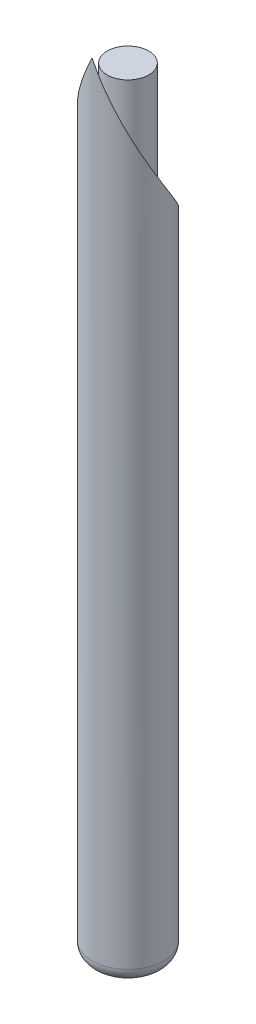
ISO-10303-21;
HEADER;
FILE_DESCRIPTION(('STEP AP214'),'2;1');
FILE_NAME('part.step','',(''),(''),'','','');
FILE_SCHEMA(('AUTOMOTIVE_DESIGN { 1 0 10303 214 1 1 1 1 }'));
ENDSEC;
DATA;
#1=APPLICATION_CONTEXT('core data for automotive mechanical design processes');
#2=APPLICATION_PROTOCOL_DEFINITION('international standard','automotive_design',2000,#1);
#3=PRODUCT_CONTEXT('',#1,'mechanical');
#4=PRODUCT('Part','Part','',(#3));
#5=PRODUCT_RELATED_PRODUCT_CATEGORY('part','',(#4));
#6=PRODUCT_DEFINITION_FORMATION('','',#4);
#7=PRODUCT_DEFINITION_CONTEXT('part definition',#1,'design');
#8=PRODUCT_DEFINITION('design','',#6,#7);
#9=PRODUCT_DEFINITION_SHAPE('','',#8);
#10=(LENGTH_UNIT() NAMED_UNIT(*) SI_UNIT(.MILLI.,.METRE.));
#11=(NAMED_UNIT(*) PLANE_ANGLE_UNIT() SI_UNIT($,.RADIAN.));
#12=(NAMED_UNIT(*) SI_UNIT($,.STERADIAN.) SOLID_ANGLE_UNIT());
#13=UNCERTAINTY_MEASURE_WITH_UNIT(LENGTH_MEASURE(1.E-05),#10,'distance_accuracy_value','');
#14=(GEOMETRIC_REPRESENTATION_CONTEXT(3) GLOBAL_UNCERTAINTY_ASSIGNED_CONTEXT((#13)) GLOBAL_UNIT_ASSIGNED_CONTEXT((#10,
#11,#12)) REPRESENTATION_CONTEXT('',''));
#15=CARTESIAN_POINT('',(0.,0.,0.));
#16=DIRECTION('',(0.,0.,1.));
#17=DIRECTION('',(1.,0.,0.));
#18=AXIS2_PLACEMENT_3D('',#15,#16,#17);
#19=CARTESIAN_POINT('',(-10.,11.1114275653245,4.99999999999909));
#20=CARTESIAN_POINT('',(-10.,2.7442766808939,4.99999999999909));
#21=CARTESIAN_POINT('',(-10.,-4.9625466788277,0.138565281185924));
#22=CARTESIAN_POINT('',(-10.,-11.1114767008031,-4.99999999999915));
#23=B_SPLINE_CURVE_WITH_KNOTS('',3,(#19,#20,#21,#22),.UNSPECIFIED.,.F.,.F.,(4,4),(0.,
0.301496066824049),.UNSPECIFIED.);
#24=DIRECTION('',(1.,0.,0.));
#25=VECTOR('',#24,1.);
#26=SURFACE_OF_LINEAR_EXTRUSION('',#23,#25);
#27=CARTESIAN_POINT('',(1.73050300992406,8.38521960200289E-13,2.32709246327587));
#28=CARTESIAN_POINT('',(1.68230439599726,0.0770166600115847,2.36293514698108));
#29=CARTESIAN_POINT('',(1.63202397147869,0.153099253088412,2.39800656917039));
#30=CARTESIAN_POINT('',(1.52671607429452,0.302813393100638,2.46639075485378));
#31=CARTESIAN_POINT('',(1.47168631458764,0.376443735236019,2.49970265846501));
#32=CARTESIAN_POINT('',(1.35631328761747,0.520133654902101,2.56413168570292));
#33=CARTESIAN_POINT('',(1.29598345697372,0.590201589529039,2.59525401866963));
#34=CARTESIAN_POINT('',(1.1690388937416,0.725541581185427,2.65485691386004));
#35=CARTESIAN_POINT('',(1.10243112589493,0.790818813238115,2.683340335692));
#36=CARTESIAN_POINT('',(0.970943418218382,0.906476096005211,2.73341292832752));
#37=CARTESIAN_POINT('',(0.906966370497955,0.957689349605518,2.755416921259));
#38=CARTESIAN_POINT('',(0.772673398173886,1.05283763679619,2.7960522768867));
#39=CARTESIAN_POINT('',(0.70235408285115,1.09676874114268,2.81468181932334));
#40=CARTESIAN_POINT('',(0.553884293782435,1.17485221371469,2.84763796004768));
#41=CARTESIAN_POINT('',(0.475633217218526,1.20885003271819,2.86189670596456));
#42=CARTESIAN_POINT('',(0.354112025385858,1.24876691496359,2.87858996076728));
#43=CARTESIAN_POINT('',(0.312951568075793,1.26022077212202,2.88336979184072));
#44=CARTESIAN_POINT('',(0.229530326683386,1.27901547733805,2.89120494543591));
#45=CARTESIAN_POINT('',(0.187269843649326,1.28635743858313,2.8942607346982));
#46=CARTESIAN_POINT('',(0.107409612613168,1.29594853557585,2.89825094700855));
#47=CARTESIAN_POINT('',(0.0698824410926284,1.29871669064601,2.89940159990666));
#48=CARTESIAN_POINT('',(-0.00528032083049251,1.30073009843542,2.9002386101587));
#49=CARTESIAN_POINT('',(-0.0429158962271985,1.29997581734118,2.89992516128322));
#50=CARTESIAN_POINT('',(-0.117926680548469,1.29497114600279,2.8978442085095));
#51=CARTESIAN_POINT('',(-0.155301784301574,1.29071941770105,2.89607614810418));
#52=CARTESIAN_POINT('',(-0.22943588539465,1.27888414004597,2.89114917411178));
#53=CARTESIAN_POINT('',(-0.266194517895001,1.2712986852812,2.88798946511734));
#54=CARTESIAN_POINT('',(-0.379291507434523,1.24285088097364,2.87612213229898));
#55=CARTESIAN_POINT('',(-0.454082945557251,1.21661342455111,2.86515607307049));
#56=CARTESIAN_POINT('',(-0.598139763325299,1.15340709432894,2.83859950101676));
#57=CARTESIAN_POINT('',(-0.667387599979585,1.11640574656495,2.82299499113159));
#58=CARTESIAN_POINT('',(-0.787612742745344,1.042312649023,2.79155232621476));
#59=CARTESIAN_POINT('',(-0.839580473628409,1.00654013866253,2.77630721203345));
#60=CARTESIAN_POINT('',(-0.939854673539082,0.931102044376801,2.74398359170851));
#61=CARTESIAN_POINT('',(-0.988165941983515,0.891441726272376,2.72690756257481));
#62=CARTESIAN_POINT('',(-1.08163216256403,0.808991710333012,2.69120426906679));
#63=CARTESIAN_POINT('',(-1.12677883471714,0.766194361718374,2.67257319571595));
#64=CARTESIAN_POINT('',(-1.21411924980476,0.678217636736536,2.63404495135817));
#65=CARTESIAN_POINT('',(-1.25631226235521,0.633037676003273,2.61414746949848));
#66=CARTESIAN_POINT('',(-1.3379975893317,0.540841732021512,2.57329471288199));
#67=CARTESIAN_POINT('',(-1.37749210620693,0.493827296486749,2.55234032562833));
#68=CARTESIAN_POINT('',(-1.45407414177045,0.398304609801829,2.50950050389542));
#69=CARTESIAN_POINT('',(-1.49116193640719,0.349796530852655,2.48761517663336));
#70=CARTESIAN_POINT('',(-1.56310088345083,0.251640963721081,2.44305198227839));
#71=CARTESIAN_POINT('',(-1.59795546863437,0.201995391698085,2.42037541856468));
#72=CARTESIAN_POINT('',(-1.66567868159732,0.101704734557945,2.37427703320652));
#73=CARTESIAN_POINT('',(-1.6985471507368,0.0510595700263876,2.35085515225777));
#74=CARTESIAN_POINT('',(-1.78349908966655,-0.0846779624380651,2.28768406080897));
#75=CARTESIAN_POINT('',(-1.83398518114569,-0.170495681165264,2.24733832014102));
#76=CARTESIAN_POINT('',(-1.93050144407487,-0.343834941333669,2.16498991408722));
#77=CARTESIAN_POINT('',(-1.97653041458353,-0.431356934392544,2.1229868064021));
#78=CARTESIAN_POINT('',(-2.10865903414454,-0.695989030295505,1.99466356592845));
#79=CARTESIAN_POINT('',(-2.18872361215452,-0.875039015776916,1.90608814692142));
#80=CARTESIAN_POINT('',(-2.33538598425081,-1.23712371945442,1.72329643635539));
#81=CARTESIAN_POINT('',(-2.40190346284312,-1.42017546133924,1.62905056304469));
#82=CARTESIAN_POINT('',(-2.52208660734763,-1.787945333404,1.43596522771786));
#83=CARTESIAN_POINT('',(-2.57575702129014,-1.97266282168381,1.33712747894787));
#84=CARTESIAN_POINT('',(-2.68963537214987,-2.41591027130043,1.09548208078914));
#85=CARTESIAN_POINT('',(-2.74408992567781,-2.67485238442002,0.950691178814285));
#86=CARTESIAN_POINT('',(-2.82951845010938,-3.19270056776102,0.653955093193511));
#87=CARTESIAN_POINT('',(-2.86047847701871,-3.45160652553973,0.502005717719115));
#88=CARTESIAN_POINT('',(-2.89776027233595,-3.96666764171407,0.192750956562281));
#89=CARTESIAN_POINT('',(-2.90417571286132,-4.22282953028617,0.0354682496808322));
#90=CARTESIAN_POINT('',(-2.89051692367582,-4.7315353069514,-0.283535260686425));
#91=CARTESIAN_POINT('',(-2.87046501339863,-4.98408206215959,-0.44525221229169));
#92=CARTESIAN_POINT('',(-2.81769743235211,-5.36079629349095,-0.691205802688302));
#93=CARTESIAN_POINT('',(-2.79602130027551,-5.48715996805384,-0.774529799352293));
#94=CARTESIAN_POINT('',(-2.74431510467675,-5.73795660127393,-0.9414750134502));
#95=CARTESIAN_POINT('',(-2.71428691384246,-5.86238998614268,-1.02509616011301));
#96=CARTESIAN_POINT('',(-2.64514970769816,-6.1088310546393,-1.19220830698354));
#97=CARTESIAN_POINT('',(-2.60603987208666,-6.23083851806391,-1.27569929474841));
#98=CARTESIAN_POINT('',(-2.51785623536858,-6.4717340837371,-1.44196306093751));
#99=CARTESIAN_POINT('',(-2.46878328903811,-6.59062245259816,-1.52473590033982));
#100=CARTESIAN_POINT('',(-2.37222635029837,-6.79733022121809,-1.66981352609809));
#101=CARTESIAN_POINT('',(-2.32699394240271,-6.88598249244594,-1.73242954791001));
#102=CARTESIAN_POINT('',(-2.22945096895466,-7.06029743660932,-1.85627631484841));
#103=CARTESIAN_POINT('',(-2.17714233252784,-7.14596091637216,-1.91750743223652));
#104=CARTESIAN_POINT('',(-2.06493731762878,-7.31337817755389,-2.037838352906));
#105=CARTESIAN_POINT('',(-2.0050595741429,-7.39514090374399,-2.09694294748806));
#106=CARTESIAN_POINT('',(-1.87686234044075,-7.5540844671095,-2.21242849862181));
#107=CARTESIAN_POINT('',(-1.80853269323971,-7.63125962312643,-2.26880606262221));
#108=CARTESIAN_POINT('',(-1.64616646332789,-7.79653876271736,-2.39010856762528));
#109=CARTESIAN_POINT('',(-1.54981877148711,-7.88313147150501,-2.4540578214102));
#110=CARTESIAN_POINT('',(-1.34260706997115,-8.0437603383005,-2.57325487270375));
#111=CARTESIAN_POINT('',(-1.23178133636758,-8.1178284631074,-2.62852479612156));
#112=CARTESIAN_POINT('',(-1.01901964196182,-8.23595278502635,-2.71699358128186));
#113=CARTESIAN_POINT('',(-0.91973214455927,-8.28304856830142,-2.75239586338613));
#114=CARTESIAN_POINT('',(-0.764639415118246,-8.34345312767741,-2.79789913441953));
#115=CARTESIAN_POINT('',(-0.711903162887541,-8.36188426554676,-2.81180232758306));
#116=CARTESIAN_POINT('',(-0.604630100725791,-8.39499663529678,-2.83680282503855));
#117=CARTESIAN_POINT('',(-0.55009415173021,-8.40967963166213,-2.84790144959147));
#118=CARTESIAN_POINT('',(-0.439036980751973,-8.43510554148116,-2.86713309805399));
#119=CARTESIAN_POINT('',(-0.382501902052503,-8.44581005945878,-2.87523721848587));
#120=CARTESIAN_POINT('',(-0.26842450588555,-8.46282089793489,-2.88812072741154));
#121=CARTESIAN_POINT('',(-0.210882706399615,-8.46912941579798,-2.89290177695734));
#122=CARTESIAN_POINT('',(-0.0953091229693715,-8.47718880179698,-2.89901039135123));
#123=CARTESIAN_POINT('',(-0.0372774846640743,-8.47894097984276,-2.90033894876207));
#124=CARTESIAN_POINT('',(0.0786978129684258,-8.47785159673812,-2.89951314891659));
#125=CARTESIAN_POINT('',(0.136641480513672,-8.4750104949719,-2.89735913995954));
#126=CARTESIAN_POINT('',(0.293814654896698,-8.46107112605116,-2.88679476075355));
#127=CARTESIAN_POINT('',(0.392466176812844,-8.44547459364759,-2.87497681132787));
#128=CARTESIAN_POINT('',(0.585278667782062,-8.40190044956194,-2.84201672125169));
#129=CARTESIAN_POINT('',(0.679437897533956,-8.37391808481015,-2.82087100107487));
#130=CARTESIAN_POINT('',(0.89035637347117,-8.29679415654616,-2.76273188854912));
#131=CARTESIAN_POINT('',(1.00489522295196,-8.24376433698968,-2.72284490784247));
#132=CARTESIAN_POINT('',(1.22171149683426,-8.12344948848929,-2.63273375234019));
#133=CARTESIAN_POINT('',(1.32396495570907,-8.05613728353395,-2.58248987608521));
#134=CARTESIAN_POINT('',(1.56098556764846,-7.87690658111683,-2.44937985334321));
#135=CARTESIAN_POINT('',(1.68867908209536,-7.75882459871959,-2.36222703113312));
#136=CARTESIAN_POINT('',(1.86200475018266,-7.57058362250005,-2.22449958557132));
#137=CARTESIAN_POINT('',(1.91680969123334,-7.50588278403591,-2.17735137702025));
#138=CARTESIAN_POINT('',(2.02077459992135,-7.37337252018839,-2.08121997407837));
#139=CARTESIAN_POINT('',(2.06993564255255,-7.30556369023875,-2.03223713149556));
#140=CARTESIAN_POINT('',(2.1927201686422,-7.12325917471145,-1.90116719605254));
#141=CARTESIAN_POINT('',(2.26190927431774,-7.00661043088665,-1.81792136136296));
#142=CARTESIAN_POINT('',(2.38771140314245,-6.76822326566457,-1.64921399104839));
#143=CARTESIAN_POINT('',(2.4443165110322,-6.64648169778275,-1.56375109842916));
#144=CARTESIAN_POINT('',(2.54627190653162,-6.39905593054706,-1.39158767278798));
#145=CARTESIAN_POINT('',(2.59161094048027,-6.27336792910339,-1.30488599301116));
#146=CARTESIAN_POINT('',(2.67205334285658,-6.01902499305385,-1.13106111426464));
#147=CARTESIAN_POINT('',(2.70715335275401,-5.89036909984038,-1.04393778649389));
#148=CARTESIAN_POINT('',(2.78701570966508,-5.54969812831929,-0.815482751615805));
#149=CARTESIAN_POINT('',(2.82412744587017,-5.33579140347661,-0.674269205466695));
#150=CARTESIAN_POINT('',(2.87665240111269,-4.90391184646166,-0.393957889371662));
#151=CARTESIAN_POINT('',(2.89205180429074,-4.68593651466645,-0.254861522242094));
#152=CARTESIAN_POINT('',(2.90320766872724,-4.24671031199961,0.0204093769865389));
#153=CARTESIAN_POINT('',(2.8989006325871,-4.02545114565984,0.156573041655156));
#154=CARTESIAN_POINT('',(2.87191176604733,-3.58153603412742,0.424567440308217));
#155=CARTESIAN_POINT('',(2.84923526304254,-3.35888051247096,0.556399419007468));
#156=CARTESIAN_POINT('',(2.79574070935853,-2.9800352741355,0.77621002568148));
#157=CARTESIAN_POINT('',(2.76940564056154,-2.82394367801146,0.865480376675198));
#158=CARTESIAN_POINT('',(2.70818900943697,-2.51187808683196,1.04133813896627));
#159=CARTESIAN_POINT('',(2.67330597324352,-2.35590411671501,1.12792508467958));
#160=CARTESIAN_POINT('',(2.59488753769218,-2.04442442582567,1.29821117209732));
#161=CARTESIAN_POINT('',(2.55134690002074,-1.88891904668661,1.38190852928626));
#162=CARTESIAN_POINT('',(2.45560071990743,-1.579873945135,1.54562896819737));
#163=CARTESIAN_POINT('',(2.40344708286854,-1.42632804992661,1.62567059941712));
#164=CARTESIAN_POINT('',(2.28974683372604,-1.12103537016558,1.78225118083327));
#165=CARTESIAN_POINT('',(2.22820502585201,-0.969287707960836,1.85879189666767));
#166=CARTESIAN_POINT('',(2.09479575860849,-0.668607795540444,2.0079462880122));
#167=CARTESIAN_POINT('',(2.02294052404254,-0.519672445032319,2.0805644746963));
#168=CARTESIAN_POINT('',(1.91170611529625,-0.309874816666721,2.18114569040532));
#169=CARTESIAN_POINT('',(1.87720902908552,-0.247278811354532,2.21093172402798));
#170=CARTESIAN_POINT('',(1.80574968694119,-0.122924280346264,2.26967260045349));
#171=CARTESIAN_POINT('',(1.76878292292087,-0.0611675482816237,2.2986257771614));
#172=CARTESIAN_POINT('',(1.73050300992406,8.38521960200289E-13,2.32709246327587));
#173=B_SPLINE_CURVE_WITH_KNOTS('',3,(#27,#28,#29,#30,#31,#32,#33,#34,#35,#36,#37,#38,#39,#40,
#41,#42,#43,#44,#45,#46,#47,#48,#49,#50,#51,#52,#53,#54,#55,#56,#57,#58,#59,#60,#61,#62,#63,#64,
#65,#66,#67,#68,#69,#70,#71,#72,#73,#74,#75,#76,#77,#78,#79,#80,#81,#82,#83,#84,#85,#86,#87,#88,
#89,#90,#91,#92,#93,#94,#95,#96,#97,#98,#99,#100,#101,#102,#103,#104,#105,#106,#107,#108,#109,
#110,#111,#112,#113,#114,#115,#116,#117,#118,#119,#120,#121,#122,#123,#124,#125,#126,#127,#128,
#129,#130,#131,#132,#133,#134,#135,#136,#137,#138,#139,#140,#141,#142,#143,#144,#145,#146,#147,
#148,#149,#150,#151,#152,#153,#154,#155,#156,#157,#158,#159,#160,#161,#162,#163,#164,#165,#166,
#167,#168,#169,#170,#171,#172),.UNSPECIFIED.,.T.,.F.,(4,2,2,2,2,2,2,2,2,2,2,2,2,2,2,2,2,2,2,2,2,
2,2,2,2,2,2,2,2,2,2,2,2,2,2,2,2,2,2,2,2,2,2,2,2,2,2,2,2,2,2,2,2,2,2,2,2,2,2,2,2,2,2,2,2,2,2,2,2,
2,2,2,4),(0.,0.292982464214421,0.586106809794494,0.878508370291095,1.17058927550365,
1.42466523670252,1.67887784704925,1.93685742161872,2.06562475632329,2.19435721379247,
2.30711114590344,2.4198501557074,2.53263231740924,2.64547902443694,2.88409404641565,
3.12343655563807,3.31787732339207,3.51205827809494,3.70672966932684,3.90144903029219,
4.09600751903361,4.29054366064888,4.48477321823459,4.67901826934766,5.00115719714184,
5.3233826829893,5.96830892320244,6.61695399323066,7.26535896498316,8.16919173306872,
9.07356050699578,9.97447437906261,10.8746290120714,11.3331556350551,11.791579530554,
12.2500448494061,12.7084708512482,13.0609993294519,13.4134318940901,13.7650130862461,
14.1170209687951,14.5491584548974,14.9801757696304,15.3250700741108,15.4975899457178,
15.6700284510267,15.8440903856063,16.0180652518476,16.191990096227,16.3658975470691,
16.6661055761925,16.966428910321,17.3613250721008,17.7569794766247,18.3371352279936,
18.6280490419605,18.9189073532912,19.3955664279048,19.8725244752426,20.3499570569994,
20.8275460670797,21.6033297062587,22.3796067649131,23.1583868746259,23.9369412083562,
24.4819424054465,25.0270376394617,25.5724636944807,26.1147153204226,26.6566903838485,
27.1980282540434,27.4302822257618,27.6629723868678),.UNSPECIFIED.);
#174=CARTESIAN_POINT('',(1.73050300992406,8.38521960200289E-13,2.32709246327587));
#175=VERTEX_POINT('',#174);
#176=EDGE_CURVE('E53',#175,#175,#173,.T.);
#177=ORIENTED_EDGE('',*,*,#176,.T.);
#178=EDGE_LOOP('',(#177));
#179=FACE_BOUND('',#178,.T.);
#180=CARTESIAN_POINT('',(0.,11.1114275653245,4.99999999999954));
#181=CARTESIAN_POINT('',(-2.75477965412102E-05,11.1114275623709,4.99999999999954));
#182=CARTESIAN_POINT('',(-5.50950145092589E-05,11.1113387333224,4.99999999980151));
#183=CARTESIAN_POINT('',(-0.000129656258571296,11.1111432887237,4.99999999872765));
#184=CARTESIAN_POINT('',(-0.000176371037977402,11.1110701057879,4.9999999974658));
#185=CARTESIAN_POINT('',(-0.000347569728575517,11.1107654379384,4.99999999035868));
#186=CARTESIAN_POINT('',(-0.000464405716010333,11.110481824439,4.99999998035564));
#187=CARTESIAN_POINT('',(-0.0007659297226874,11.1098087371728,4.99999994405016));
#188=CARTESIAN_POINT('',(-0.000955468159692825,11.1094367515142,4.99999991211613));
#189=CARTESIAN_POINT('',(-0.00129785626407136,11.1087373769675,4.99999983444198));
#190=CARTESIAN_POINT('',(-0.00145158923641117,11.1084127875938,4.99999979185882));
#191=CARTESIAN_POINT('',(-0.0018551322609275,11.1075676832822,4.99999966175554));
#192=CARTESIAN_POINT('',(-0.00210588411334606,11.1070494418297,4.99999956270523));
#193=CARTESIAN_POINT('',(-0.00262046813742951,11.1059821081978,4.99999932047722));
#194=CARTESIAN_POINT('',(-0.00288425091009979,11.1054329055037,4.99999917514889));
#195=CARTESIAN_POINT('',(-0.0035761241402282,11.1039936014636,4.99999873932914));
#196=CARTESIAN_POINT('',(-0.0040043952034881,11.1031038666843,4.99999841476398));
#197=CARTESIAN_POINT('',(-0.0051788215810428,11.1006633113504,4.99999737376488));
#198=CARTESIAN_POINT('',(-0.00592485077210575,11.0991122478008,4.99999654531638));
#199=CARTESIAN_POINT('',(-0.00746028489024223,11.0959202791843,4.99999449667811));
#200=CARTESIAN_POINT('',(-0.00824969429072908,11.0942793845873,4.99999325654276));
#201=CARTESIAN_POINT('',(-0.0102737892217539,11.0900718568615,4.99998959739759));
#202=CARTESIAN_POINT('',(-0.0115084453704152,11.0875051879735,4.99998690801291));
#203=CARTESIAN_POINT('',(-0.0674069904726457,10.9712975050435,4.99984444233771));
#204=CARTESIAN_POINT('',(-0.122023306655351,10.85763363418,4.99880875531218));
#205=CARTESIAN_POINT('',(-0.231513294906996,10.6294286240733,4.99493989245127));
#206=CARTESIAN_POINT('',(-0.286385893448264,10.5148871985541,4.99209351350409));
#207=CARTESIAN_POINT('',(-0.399932175634804,10.2774177829449,4.98432786517087));
#208=CARTESIAN_POINT('',(-0.458591289056726,10.1544872389868,4.97927258764429));
#209=CARTESIAN_POINT('',(-0.575510989138534,9.90884488223761,4.96711532416942));
#210=CARTESIAN_POINT('',(-0.633772143116104,9.78613313207085,4.96001751434461));
#211=CARTESIAN_POINT('',(-0.752944760614538,9.53437983188047,4.94336702341669));
#212=CARTESIAN_POINT('',(-0.813838593674278,9.40533700306709,4.93370694883109));
#213=CARTESIAN_POINT('',(-0.935224366459052,9.14716285384425,4.91214389113875));
#214=CARTESIAN_POINT('',(-0.995716062428041,9.01803152429966,4.90023965693463));
#215=CARTESIAN_POINT('',(-1.17997646414366,8.62304352003009,4.86042722434636));
#216=CARTESIAN_POINT('',(-1.3029386628586,8.3571636228806,4.82891787366187));
#217=CARTESIAN_POINT('',(-1.54751293402046,7.82252609559611,4.75622310900301));
#218=CARTESIAN_POINT('',(-1.66909537233899,7.55376891184695,4.71493528308808));
#219=CARTESIAN_POINT('',(-1.90813356555978,7.01817841608128,4.62334260357138));
#220=CARTESIAN_POINT('',(-2.02561164187027,6.75134436722435,4.5731005187958));
#221=CARTESIAN_POINT('',(-2.22976729105648,6.28009801005239,4.4763546864095));
#222=CARTESIAN_POINT('',(-2.31723715988123,6.07564427821915,4.43171279858632));
#223=CARTESIAN_POINT('',(-2.48832537710438,5.67005495705965,4.33792636371446));
#224=CARTESIAN_POINT('',(-2.57198242179697,5.46891708933807,4.28886239699942));
#225=CARTESIAN_POINT('',(-2.73566874326332,5.06912504842962,4.18632729667025));
#226=CARTESIAN_POINT('',(-2.81572858525961,4.87046880033211,4.13291304114198));
#227=CARTESIAN_POINT('',(-2.97241056407034,4.47481307785262,4.02168355696149));
#228=CARTESIAN_POINT('',(-3.0490534379387,4.27781204548923,3.96390309261016));
#229=CARTESIAN_POINT('',(-3.19904927793837,3.88464534009828,3.84386307536133));
#230=CARTESIAN_POINT('',(-3.27241133543551,3.68847892335488,3.78161732890677));
#231=CARTESIAN_POINT('',(-3.41594200153848,3.29616358655547,3.6524885123261));
#232=CARTESIAN_POINT('',(-3.48610598522534,3.10001507720036,3.58559905842392));
#233=CARTESIAN_POINT('',(-3.64238366304732,2.65215968912115,3.42763159660805));
#234=CARTESIAN_POINT('',(-3.72733978501453,2.40056059393121,3.33509536491834));
#235=CARTESIAN_POINT('',(-3.89123781001005,1.89676143250697,3.14234825389432));
#236=CARTESIAN_POINT('',(-3.97014736072069,1.64456469540733,3.04210116012439));
#237=CARTESIAN_POINT('',(-4.12109759147232,1.14026151003872,2.83427146658492));
#238=CARTESIAN_POINT('',(-4.19311878981057,0.88815721640272,2.72666945642194));
#239=CARTESIAN_POINT('',(-4.32946357638581,0.384714874870375,2.50454357866317));
#240=CARTESIAN_POINT('',(-4.39378231822123,0.133377405364456,2.39001542060944));
#241=CARTESIAN_POINT('',(-4.51715341691218,-0.381352900063166,2.14818602400201));
#242=CARTESIAN_POINT('',(-4.57575369023448,-0.644687894249635,2.02052997378479));
#243=CARTESIAN_POINT('',(-4.68273320509378,-1.16960583859322,1.75841438178637));
#244=CARTESIAN_POINT('',(-4.73112578080816,-1.43119063678109,1.62396400369298));
#245=CARTESIAN_POINT('',(-4.8168454260459,-1.95245178048858,1.34861835030016));
#246=CARTESIAN_POINT('',(-4.85418325228475,-2.21212973984542,1.20772949505478));
#247=CARTESIAN_POINT('',(-4.91686289042724,-2.72944590741997,0.919864751766855));
#248=CARTESIAN_POINT('',(-4.94220911435854,-2.98708483149346,0.772891124151539));
#249=CARTESIAN_POINT('',(-4.97601275993238,-3.44792684371596,0.503751480766713));
#250=CARTESIAN_POINT('',(-4.98685509313824,-3.65155592440574,0.382611325714748));
#251=CARTESIAN_POINT('',(-4.9996345678854,-4.05715511187592,0.137027251622211));
#252=CARTESIAN_POINT('',(-5.00157013437704,-4.25912491893163,0.0125827521629223));
#253=CARTESIAN_POINT('',(-4.99586011098333,-4.66113463509009,-0.239273047622356));
#254=CARTESIAN_POINT('',(-4.98821263493191,-4.86117415645762,-0.366684927153193));
#255=CARTESIAN_POINT('',(-4.96273363241543,-5.2566956089432,-0.622592851717277));
#256=CARTESIAN_POINT('',(-4.94501869854126,-5.45220349914842,-0.751060170871016));
#257=CARTESIAN_POINT('',(-4.8986922871233,-5.84055007096577,-1.01000599221344));
#258=CARTESIAN_POINT('',(-4.87008253510075,-6.03338917025133,-1.14048417278352));
#259=CARTESIAN_POINT('',(-4.8010758172354,-6.41587955974413,-1.4028789796608));
#260=CARTESIAN_POINT('',(-4.76068272155411,-6.60553187503385,-1.53479512000716));
#261=CARTESIAN_POINT('',(-4.66582816501786,-6.98616259446755,-1.80300459994474));
#262=CARTESIAN_POINT('',(-4.61101704594235,-7.17703910140899,-1.93932012770967));
#263=CARTESIAN_POINT('',(-4.48663483302022,-7.55401613601779,-2.21191225431885));
#264=CARTESIAN_POINT('',(-4.41706270630785,-7.7401163284521,-2.34818884977038));
#265=CARTESIAN_POINT('',(-4.26167806662057,-8.10656540332579,-2.61965360166582));
#266=CARTESIAN_POINT('',(-4.17585141586389,-8.2869091181583,-2.75484070297662));
#267=CARTESIAN_POINT('',(-3.98642567304358,-8.6401311433858,-3.02246253680395));
#268=CARTESIAN_POINT('',(-3.88283440865805,-8.81301270003658,-3.1548984528903));
#269=CARTESIAN_POINT('',(-3.69516157782283,-9.09140971526357,-3.37024680271153));
#270=CARTESIAN_POINT('',(-3.61664046419463,-9.19962782924891,-3.4545127573117));
#271=CARTESIAN_POINT('',(-3.45069948891172,-9.4112480164396,-3.62028094916322));
#272=CARTESIAN_POINT('',(-3.36327821750283,-9.51464932288676,-3.70178274584741));
#273=CARTESIAN_POINT('',(-3.08714951771208,-9.81601564535479,-3.94064781222629));
#274=CARTESIAN_POINT('',(-2.88422860575065,-10.0056756678486,-4.09278424296541));
#275=CARTESIAN_POINT('',(-2.49429803464304,-10.3085763117055,-4.33787288235308));
#276=CARTESIAN_POINT('',(-2.31625501950587,-10.4290103210001,-4.43605989544758));
#277=CARTESIAN_POINT('',(-2.03254621172206,-10.5917586107163,-4.56942916441705));
#278=CARTESIAN_POINT('',(-1.93521804053659,-10.6430180536019,-4.61156189096493));
#279=CARTESIAN_POINT('',(-1.73520876537529,-10.7388080498335,-4.6904791252934));
#280=CARTESIAN_POINT('',(-1.63252886630474,-10.7833401090776,-4.72726482991373));
#281=CARTESIAN_POINT('',(-1.4413135293103,-10.8574629728196,-4.78861088172825));
#282=CARTESIAN_POINT('',(-1.35358223740769,-10.8882992092719,-4.81417886331127));
#283=CARTESIAN_POINT('',(-1.17520826942695,-10.944454097707,-4.86080013276577));
#284=CARTESIAN_POINT('',(-1.08456620326982,-10.9697738970543,-4.88185435943914));
#285=CARTESIAN_POINT('',(-0.900862903345278,-11.0144824755091,-4.91906760043266));
#286=CARTESIAN_POINT('',(-0.807802261153509,-11.0338726904319,-4.93522779980479));
#287=CARTESIAN_POINT('',(-0.619875030083217,-11.0663756608389,-4.96233440281418));
#288=CARTESIAN_POINT('',(-0.52500918240123,-11.0794909372842,-4.97328290024756));
#289=CARTESIAN_POINT('',(-0.333713172886798,-11.0992447793301,-4.98977868155688));
#290=CARTESIAN_POINT('',(-0.237277988649294,-11.1058548092051,-4.99530216802682));
#291=CARTESIAN_POINT('',(-0.0440323081885451,-11.1123626979843,-5.0007402747126));
#292=CARTESIAN_POINT('',(0.0527781474186929,-11.112261264054,-5.00065548585464));
#293=CARTESIAN_POINT('',(0.245976023556221,-11.1053505310408,-4.99488081518783));
#294=CARTESIAN_POINT('',(0.342363501863127,-11.0985421786734,-4.98919172445456));
#295=CARTESIAN_POINT('',(0.534004060437064,-11.0783534173566,-4.97233325413571));
#296=CARTESIAN_POINT('',(0.629256598506015,-11.0649699868126,-4.96116135491332));
#297=CARTESIAN_POINT('',(0.812008967614469,-11.0329187998855,-4.93443306311852));
#298=CARTESIAN_POINT('',(0.899622343259695,-11.0146317729239,-4.9191928293514));
#299=CARTESIAN_POINT('',(1.07271569143091,-10.9727996564819,-4.88437196550911));
#300=CARTESIAN_POINT('',(1.15819485493688,-10.9492526057336,-4.8647897164777));
#301=CARTESIAN_POINT('',(1.41091677835831,-10.8711704779871,-4.79994864938779));
#302=CARTESIAN_POINT('',(1.57439999167491,-10.8092023689263,-4.74860216348226));
#303=CARTESIAN_POINT('',(1.84246967256203,-10.6893063124054,-4.6496620311965));
#304=CARTESIAN_POINT('',(1.9502482240719,-10.635540498835,-4.60539806571499));
#305=CARTESIAN_POINT('',(2.15915842317228,-10.5207829258092,-4.51122285727112));
#306=CARTESIAN_POINT('',(2.26029596851563,-10.459797716478,-4.46131673523279));
#307=CARTESIAN_POINT('',(2.45605345326493,-10.3314035393134,-4.35662226583343));
#308=CARTESIAN_POINT('',(2.55065940175561,-10.2639814768136,-4.30182398155841));
#309=CARTESIAN_POINT('',(2.73319409308719,-10.1236606284309,-4.18822267589852));
#310=CARTESIAN_POINT('',(2.82112052422481,-10.0507599636752,-4.12941828128042));
#311=CARTESIAN_POINT('',(3.02949876749677,-9.86549399255146,-3.98061026819267));
#312=CARTESIAN_POINT('',(3.14623379013495,-9.75044257841612,-3.8887327297223));
#313=CARTESIAN_POINT('',(3.36640198009077,-9.51219164372529,-3.69978328676311));
#314=CARTESIAN_POINT('',(3.4698301119488,-9.38898906523628,-3.60270943549945));
#315=CARTESIAN_POINT('',(3.66437078457234,-9.13573755487535,-3.40465651892833));
#316=CARTESIAN_POINT('',(3.75546142459504,-9.00567700314817,-3.30367090786769));
#317=CARTESIAN_POINT('',(3.92599201166611,-8.74006155825267,-3.09908421050355));
#318=CARTESIAN_POINT('',(4.00542782039183,-8.60450473520462,-2.99548221042053));
#319=CARTESIAN_POINT('',(4.19747602690028,-8.24688816632619,-2.72449916389718));
#320=CARTESIAN_POINT('',(4.30173866034885,-8.02131015618579,-2.55581583802423));
#321=CARTESIAN_POINT('',(4.48575736928149,-7.56138592676603,-2.21701492902091));
#322=CARTESIAN_POINT('',(4.5654992515836,-7.32703471704885,-2.04689657356837));
#323=CARTESIAN_POINT('',(4.70292645499235,-6.85198850307275,-1.70760539810592));
#324=CARTESIAN_POINT('',(4.76064899668053,-6.61130494575223,-1.53843146308887));
#325=CARTESIAN_POINT('',(4.85644410019865,-6.12465531365002,-1.20228383900557));
#326=CARTESIAN_POINT('',(4.8945186982245,-5.87868978901298,-1.03530992369077));
#327=CARTESIAN_POINT('',(4.95459927772303,-5.36834489222499,-0.695287182484569));
#328=CARTESIAN_POINT('',(4.97556643025325,-5.1037147020982,-0.522434085668806));
#329=CARTESIAN_POINT('',(4.99962915845966,-4.57046897451529,-0.181464323696104));
#330=CARTESIAN_POINT('',(5.00271557470363,-4.30185146516689,-0.0133501299174329));
#331=CARTESIAN_POINT('',(4.99266619512027,-3.76138961249895,0.317230494612639));
#332=CARTESIAN_POINT('',(4.97952596756205,-3.48954440773493,0.479695369991704));
#333=CARTESIAN_POINT('',(4.93810808833737,-2.93823244685709,0.801141612937415));
#334=CARTESIAN_POINT('',(4.90955698090495,-2.65871738914767,0.960004282521113));
#335=CARTESIAN_POINT('',(4.8385334522055,-2.0975324871026,1.27040664628794));
#336=CARTESIAN_POINT('',(4.7960653924096,-1.81586334481672,1.42194861767389));
#337=CARTESIAN_POINT('',(4.69845454206906,-1.25075692342663,1.71717406511313));
#338=CARTESIAN_POINT('',(4.64331630348013,-0.967320314804441,1.86086034055048));
#339=CARTESIAN_POINT('',(4.51544321741303,-0.370750324455911,2.15378174330029));
#340=CARTESIAN_POINT('',(4.44150708176433,-0.0574534770483264,2.30215919246286));
#341=CARTESIAN_POINT('',(4.28099423010914,0.570800914430916,2.58844106383667));
#342=CARTESIAN_POINT('',(4.1944132975216,0.885758978556535,2.72634196909033));
#343=CARTESIAN_POINT('',(4.00976356667689,1.51734877269322,2.99130457643698));
#344=CARTESIAN_POINT('',(3.91168064566455,1.83398209463546,3.11835261504196));
#345=CARTESIAN_POINT('',(3.70508361937107,2.46891339205793,3.36122315995195));
#346=CARTESIAN_POINT('',(3.59654964600942,2.78721340531644,3.47702340971759));
#347=CARTESIAN_POINT('',(3.37877097880548,3.40085816622737,3.68852198043868));
#348=CARTESIAN_POINT('',(3.27018427097842,3.69614259615683,3.78507561790057));
#349=CARTESIAN_POINT('',(3.04610137600938,4.28705798342693,3.96763588452737));
#350=CARTESIAN_POINT('',(2.93061074635476,4.58268847913248,4.05365083140767));
#351=CARTESIAN_POINT('',(2.69392669747892,5.17322622414442,4.21463670945168));
#352=CARTESIAN_POINT('',(2.5727575900133,5.46813172164731,4.28964989703686));
#353=CARTESIAN_POINT('',(2.32597271351126,6.05614422083034,4.42828807523872));
#354=CARTESIAN_POINT('',(2.20039539408832,6.34924882343246,4.4919914254879));
#355=CARTESIAN_POINT('',(2.01735746108371,6.76909500756607,4.57536346162758));
#356=CARTESIAN_POINT('',(1.96172288982068,6.89576356980811,4.59949081881144));
#357=CARTESIAN_POINT('',(1.84961798007199,7.14925836889752,4.6457068954919));
#358=CARTESIAN_POINT('',(1.79314687090607,7.27608463797626,4.66779357941941));
#359=CARTESIAN_POINT('',(1.67910994648798,7.53059485812239,4.71002241123707));
#360=CARTESIAN_POINT('',(1.62153937085589,7.65827895650652,4.730150793742));
#361=CARTESIAN_POINT('',(1.50502854033472,7.91520867189639,4.76851088255893));
#362=CARTESIAN_POINT('',(1.4460801415352,8.04445447007707,4.78671666253163));
#363=CARTESIAN_POINT('',(1.32652682224836,8.30521267885766,4.82123066192852));
#364=CARTESIAN_POINT('',(1.26591096149389,8.43672519633911,4.83750012401824));
#365=CARTESIAN_POINT('',(1.1237486859828,8.74370425220136,4.87280196302529));
#366=CARTESIAN_POINT('',(1.04197799780331,8.9191703953293,4.89094034624571));
#367=CARTESIAN_POINT('',(0.877280154500446,9.27070888519906,4.92315402026922));
#368=CARTESIAN_POINT('',(0.794349898603942,9.44678114342079,4.93721446923751));
#369=CARTESIAN_POINT('',(0.670315833649187,9.70897787704872,4.9550350133238));
#370=CARTESIAN_POINT('',(0.629477799157466,9.79512250869152,4.96038860224925));
#371=CARTESIAN_POINT('',(0.547675673810352,9.96735059733833,4.97008518814198));
#372=CARTESIAN_POINT('',(0.506711665412991,10.0534340617761,4.97442874385576));
#373=CARTESIAN_POINT('',(0.426642813380678,10.2214139593792,4.98191864871341));
#374=CARTESIAN_POINT('',(0.387544056966675,10.3033111723424,4.98511280818496));
#375=CARTESIAN_POINT('',(0.309167400616044,10.467254700789,4.99058732519674));
#376=CARTESIAN_POINT('',(0.269889298195299,10.549300981953,4.99286581704932));
#377=CARTESIAN_POINT('',(0.194194498402418,10.7072313980696,4.99636012463045));
#378=CARTESIAN_POINT('',(0.157783769810384,10.7831169240998,4.99764273751004));
#379=CARTESIAN_POINT('',(0.0851697346308827,10.9343175571592,4.99940551011619));
#380=CARTESIAN_POINT('',(0.0489668461476114,11.0096327976337,4.99989143990048));
#381=CARTESIAN_POINT('',(0.0115087170290571,11.0875046229053,4.99998690731594));
#382=CARTESIAN_POINT('',(0.0102743325458177,11.0900707273119,4.9999895962131));
#383=CARTESIAN_POINT('',(0.00825084287918262,11.0942769970022,4.9999932545955));
#384=CARTESIAN_POINT('',(0.00746176707910103,11.0959171981578,4.99999449441389));
#385=CARTESIAN_POINT('',(0.00592698062785044,11.0991078204267,4.99999654274511));
#386=CARTESIAN_POINT('',(0.00518126550407032,11.1006582310729,4.99999737118608));
#387=CARTESIAN_POINT('',(0.00400687121837323,11.1030987196651,4.99999841280443));
#388=CARTESIAN_POINT('',(0.00357831802516585,11.1039890402489,4.9999987377834));
#389=CARTESIAN_POINT('',(0.00288596540402429,11.1054293423865,4.9999991741702));
#390=CARTESIAN_POINT('',(0.00262198510777581,11.105978957,4.99999931969284));
#391=CARTESIAN_POINT('',(0.00210702098200602,11.1070470775366,4.9999995622352));
#392=CARTESIAN_POINT('',(0.00185608665598967,11.1075656941553,4.99999966140968));
#393=CARTESIAN_POINT('',(0.00145227968003843,11.108411355356,4.99999979166128));
#394=CARTESIAN_POINT('',(0.00129846347664584,11.1087361233167,4.99999983428787));
#395=CARTESIAN_POINT('',(0.000955872051399093,11.1094359077413,4.99999991204323));
#396=CARTESIAN_POINT('',(0.000766211905997849,11.1098081208292,4.99999994400997));
#397=CARTESIAN_POINT('',(0.000464537493739522,11.1104815700442,4.99999998034517));
#398=CARTESIAN_POINT('',(0.000347663658074803,11.1107652935207,4.99999999035457));
#399=CARTESIAN_POINT('',(0.000176405038189242,11.1110700498867,4.9999999974651));
#400=CARTESIAN_POINT('',(0.000129678414526379,11.1111432448392,4.99999999872736));
#401=CARTESIAN_POINT('',(5.51014307960396E-05,11.1113387281793,4.99999999980148));
#402=CARTESIAN_POINT('',(2.75504260562099E-05,11.1114275682784,4.99999999999955));
#403=CARTESIAN_POINT('',(0.,11.1114275653245,4.99999999999954));
#404=B_SPLINE_CURVE_WITH_KNOTS('',3,(#180,#181,#182,#183,#184,#185,#186,#187,#188,#189,#190,
#191,#192,#193,#194,#195,#196,#197,#198,#199,#200,#201,#202,#203,#204,#205,#206,#207,#208,#209,
#210,#211,#212,#213,#214,#215,#216,#217,#218,#219,#220,#221,#222,#223,#224,#225,#226,#227,#228,
#229,#230,#231,#232,#233,#234,#235,#236,#237,#238,#239,#240,#241,#242,#243,#244,#245,#246,#247,
#248,#249,#250,#251,#252,#253,#254,#255,#256,#257,#258,#259,#260,#261,#262,#263,#264,#265,#266,
#267,#268,#269,#270,#271,#272,#273,#274,#275,#276,#277,#278,#279,#280,#281,#282,#283,#284,#285,
#286,#287,#288,#289,#290,#291,#292,#293,#294,#295,#296,#297,#298,#299,#300,#301,#302,#303,#304,
#305,#306,#307,#308,#309,#310,#311,#312,#313,#314,#315,#316,#317,#318,#319,#320,#321,#322,#323,
#324,#325,#326,#327,#328,#329,#330,#331,#332,#333,#334,#335,#336,#337,#338,#339,#340,#341,#342,
#343,#344,#345,#346,#347,#348,#349,#350,#351,#352,#353,#354,#355,#356,#357,#358,#359,#360,#361,
#362,#363,#364,#365,#366,#367,#368,#369,#370,#371,#372,#373,#374,#375,#376,#377,#378,#379,#380,
#381,#382,#383,#384,#385,#386,#387,#388,#389,#390,#391,#392,#393,#394,#395,#396,#397,#398,#399,
#400,#401,#402,#403),.UNSPECIFIED.,.T.,.F.,(4,2,2,2,2,2,2,2,2,2,2,2,2,2,2,2,2,2,2,2,2,2,2,2,2,2,
2,2,2,2,2,2,2,2,2,2,2,2,2,2,2,2,2,2,2,2,2,2,2,2,2,2,2,2,2,2,2,2,2,2,2,2,2,2,2,2,2,2,2,2,2,2,2,2,
2,2,2,2,2,2,2,2,2,2,2,2,2,2,2,2,2,2,2,2,2,2,2,2,2,2,2,2,2,2,2,2,2,2,2,2,2,4),(0.,
0.000180582854829985,0.00049149635209585,0.00134896356967227,0.00263281387452405,
0.00370432599206533,0.00543481749044407,0.00726169942294405,0.0102245164231269,
0.0153876596122632,0.0208504655801319,0.0293949952038124,0.407708108555432,0.788811910179498,
1.19770306437189,1.60576407594494,2.03479119976418,2.46405821319438,3.34776385386946,
4.24116939020032,5.12854231981655,5.8089184851781,6.47874143469498,7.14089689572618,
7.79824537688605,8.45364236809582,9.10995890126614,9.95343941821822,10.8011566651021,
11.6512046184274,12.5017846443886,13.3969011332325,14.290841001489,15.1839081498439,
16.0766464591517,16.7880265961309,17.4995325269059,18.2111785206258,18.9147460645523,
19.6182022237694,20.3214275970849,21.0435962240249,21.76581539964,22.4886656527193,
23.2111982085821,23.6849952185414,24.1588673934151,25.1043531769336,25.8105937245319,
26.1636105670766,26.5165482707359,26.8055981604454,27.094587873115,27.3835075530418,
27.6723110616038,27.9623758544757,28.2524100841882,28.542403379966,28.8325300677733,
29.1045997709253,29.3767710886078,29.9212478609131,30.3057549546734,30.6899158228259,
31.0748755647209,31.4599679354144,32.0227842652973,32.5858129479566,33.1498283390538,
33.7140435149549,34.6136683025348,35.5138128379515,36.4124289918769,37.3109519998614,
38.2606561876218,39.2108468196975,40.1612970199698,41.1291950274763,42.0967899924436,
43.0640378760999,44.1269902885013,45.1902979697364,46.2549251833115,47.3216178507867,
48.3086748561698,49.2949477335702,50.277327249366,51.2526094883844,51.6739042785888,
52.0956148725317,52.5201029754879,52.9497326479446,53.3868765180414,53.9701262351658,
54.5554728180036,54.8419221047612,55.128212549876,55.4006315801687,55.6736028882639,
55.9261342941842,56.1768285037998,56.1853711533826,56.1908316508544,56.1959926206361,
56.1989573887859,56.2007856402016,56.2025173867199,56.2035894853222,56.2048741379339,
56.2057319201404,56.206042899169,56.206223499261),.UNSPECIFIED.);
#405=CARTESIAN_POINT('',(0.,11.1114275653245,5.));
#406=VERTEX_POINT('',#405);
#407=EDGE_CURVE('E50',#406,#406,#404,.T.);
#408=ORIENTED_EDGE('',*,*,#407,.F.);
#409=EDGE_LOOP('',(#408));
#410=FACE_BOUND('',#409,.T.);
#411=ADVANCED_FACE('F39',(#179,#410),#26,.F.);
#412=CARTESIAN_POINT('',(0.,8.,0.));
#413=DIRECTION('',(0.,-1.,0.));
#414=DIRECTION('',(0.,0.,-1.));
#415=AXIS2_PLACEMENT_3D('',#412,#413,#414);
#416=CYLINDRICAL_SURFACE('',#415,2.9);
#417=CARTESIAN_POINT('',(0.,8.,0.));
#418=DIRECTION('',(0.,1.,0.));
#419=DIRECTION('',(0.,0.,1.));
#420=AXIS2_PLACEMENT_3D('',#417,#418,#419);
#421=CIRCLE('',#420,2.9);
#422=CARTESIAN_POINT('',(0.,8.,2.9));
#423=VERTEX_POINT('',#422);
#424=EDGE_CURVE('E56',#423,#423,#421,.T.);
#425=ORIENTED_EDGE('',*,*,#424,.F.);
#426=EDGE_LOOP('',(#425));
#427=FACE_BOUND('',#426,.T.);
#428=ORIENTED_EDGE('',*,*,#176,.F.);
#429=EDGE_LOOP('',(#428));
#430=FACE_BOUND('',#429,.T.);
#431=ADVANCED_FACE('F72',(#427,#430),#416,.T.);
#432=CARTESIAN_POINT('',(0.,8.,0.));
#433=DIRECTION('',(0.,1.,0.));
#434=DIRECTION('',(0.,0.,1.));
#435=AXIS2_PLACEMENT_3D('',#432,#433,#434);
#436=PLANE('',#435);
#437=ORIENTED_EDGE('',*,*,#424,.T.);
#438=EDGE_LOOP('',(#437));
#439=FACE_BOUND('',#438,.T.);
#440=ADVANCED_FACE('F84',(#439),#436,.T.);
#441=CARTESIAN_POINT('',(0.,-100.,0.));
#442=DIRECTION('',(0.,-1.,0.));
#443=DIRECTION('',(0.,0.,-1.));
#444=AXIS2_PLACEMENT_3D('',#441,#442,#443);
#445=PLANE('',#444);
#446=CARTESIAN_POINT('',(0.,-100.,0.));
#447=DIRECTION('',(0.,-1.,0.));
#448=DIRECTION('',(0.,0.,-1.));
#449=AXIS2_PLACEMENT_3D('',#446,#447,#448);
#450=CIRCLE('',#449,3.);
#451=CARTESIAN_POINT('',(0.,-100.,-3.));
#452=VERTEX_POINT('',#451);
#453=EDGE_CURVE('E46',#452,#452,#450,.T.);
#454=ORIENTED_EDGE('',*,*,#453,.T.);
#455=EDGE_LOOP('',(#454));
#456=FACE_BOUND('',#455,.T.);
#457=ADVANCED_FACE('F74',(#456),#445,.T.);
#458=CARTESIAN_POINT('',(0.,-100.,0.));
#459=DIRECTION('',(0.,1.,0.));
#460=DIRECTION('',(0.,0.,1.));
#461=AXIS2_PLACEMENT_3D('',#458,#459,#460);
#462=CYLINDRICAL_SURFACE('',#461,5.);
#463=CARTESIAN_POINT('',(0.,-98.,0.));
#464=DIRECTION('',(0.,-1.,0.));
#465=DIRECTION('',(0.,0.,-1.));
#466=AXIS2_PLACEMENT_3D('',#463,#464,#465);
#467=CIRCLE('',#466,5.);
#468=CARTESIAN_POINT('',(0.,-98.,-5.));
#469=VERTEX_POINT('',#468);
#470=EDGE_CURVE('E11',#469,#469,#467,.F.);
#471=ORIENTED_EDGE('',*,*,#470,.T.);
#472=EDGE_LOOP('',(#471));
#473=FACE_BOUND('',#472,.T.);
#474=ORIENTED_EDGE('',*,*,#407,.T.);
#475=EDGE_LOOP('',(#474));
#476=FACE_BOUND('',#475,.T.);
#477=ADVANCED_FACE('F51',(#473,#476),#462,.T.);
#478=CARTESIAN_POINT('',(0.,-98.,0.));
#479=DIRECTION('',(0.,-1.,0.));
#480=DIRECTION('',(0.,0.,-1.));
#481=AXIS2_PLACEMENT_3D('',#478,#479,#480);
#482=TOROIDAL_SURFACE('',#481,3.,2.);
#483=ORIENTED_EDGE('',*,*,#470,.F.);
#484=EDGE_LOOP('',(#483));
#485=FACE_BOUND('',#484,.T.);
#486=ORIENTED_EDGE('',*,*,#453,.F.);
#487=EDGE_LOOP('',(#486));
#488=FACE_BOUND('',#487,.T.);
#489=ADVANCED_FACE('F41',(#485,#488),#482,.T.);
#490=CLOSED_SHELL('',(#411,#431,#440,#457,#477,#489));
#491=MANIFOLD_SOLID_BREP('B2',#490);
#492=ADVANCED_BREP_SHAPE_REPRESENTATION('',(#18,#491),#14);
#493=SHAPE_DEFINITION_REPRESENTATION(#9,#492);
ENDSEC;
END-ISO-10303-21;
